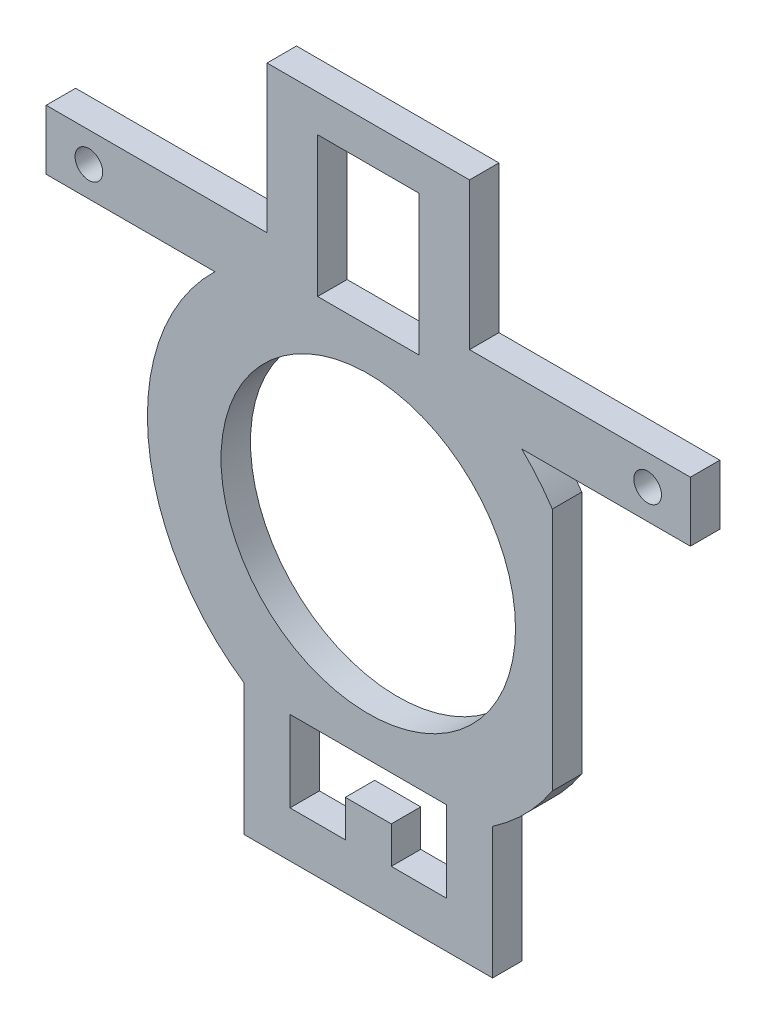
ISO-10303-21;
HEADER;
FILE_DESCRIPTION(('STEP AP214'),'2;1');
FILE_NAME('part.step','',(''),(''),'','','');
FILE_SCHEMA(('AUTOMOTIVE_DESIGN { 1 0 10303 214 1 1 1 1 }'));
ENDSEC;
DATA;
#1=APPLICATION_CONTEXT('core data for automotive mechanical design processes');
#2=APPLICATION_PROTOCOL_DEFINITION('international standard','automotive_design',2000,#1);
#3=PRODUCT_CONTEXT('',#1,'mechanical');
#4=PRODUCT('Part','Part','',(#3));
#5=PRODUCT_RELATED_PRODUCT_CATEGORY('part','',(#4));
#6=PRODUCT_DEFINITION_FORMATION('','',#4);
#7=PRODUCT_DEFINITION_CONTEXT('part definition',#1,'design');
#8=PRODUCT_DEFINITION('design','',#6,#7);
#9=PRODUCT_DEFINITION_SHAPE('','',#8);
#10=(LENGTH_UNIT() NAMED_UNIT(*) SI_UNIT(.MILLI.,.METRE.));
#11=(NAMED_UNIT(*) PLANE_ANGLE_UNIT() SI_UNIT($,.RADIAN.));
#12=(NAMED_UNIT(*) SI_UNIT($,.STERADIAN.) SOLID_ANGLE_UNIT());
#13=UNCERTAINTY_MEASURE_WITH_UNIT(LENGTH_MEASURE(1.E-05),#10,'distance_accuracy_value','');
#14=(GEOMETRIC_REPRESENTATION_CONTEXT(3) GLOBAL_UNCERTAINTY_ASSIGNED_CONTEXT((#13)) GLOBAL_UNIT_ASSIGNED_CONTEXT((#10,
#11,#12)) REPRESENTATION_CONTEXT('',''));
#15=CARTESIAN_POINT('',(0.,0.,0.));
#16=DIRECTION('',(0.,0.,1.));
#17=DIRECTION('',(1.,0.,0.));
#18=AXIS2_PLACEMENT_3D('',#15,#16,#17);
#19=CARTESIAN_POINT('',(-4.2545,-39.0072043434314,1.6));
#20=DIRECTION('',(-1.,0.,0.));
#21=DIRECTION('',(0.,-1.,0.));
#22=AXIS2_PLACEMENT_3D('',#19,#20,#21);
#23=PLANE('',#22);
#24=DIRECTION('',(0.,1.,0.));
#25=VECTOR('',#24,1.);
#26=CARTESIAN_POINT('',(-4.2545,-39.0072043434314,0.));
#27=LINE('',#26,#25);
#28=CARTESIAN_POINT('',(-4.2545,-14.554889955105,0.));
#29=VERTEX_POINT('',#28);
#30=CARTESIAN_POINT('',(-4.2545,-10.154889955105,0.));
#31=VERTEX_POINT('',#30);
#32=EDGE_CURVE('E313',#29,#31,#27,.T.);
#33=ORIENTED_EDGE('',*,*,#32,.T.);
#34=DIRECTION('',(0.,0.,-1.));
#35=VECTOR('',#34,1.);
#36=CARTESIAN_POINT('',(-4.2545,-10.154889955105,1.6));
#37=LINE('',#36,#35);
#38=CARTESIAN_POINT('',(-4.2545,-10.154889955105,1.6));
#39=VERTEX_POINT('',#38);
#40=EDGE_CURVE('E11',#39,#31,#37,.T.);
#41=ORIENTED_EDGE('',*,*,#40,.F.);
#42=DIRECTION('',(0.,1.,0.));
#43=VECTOR('',#42,1.);
#44=CARTESIAN_POINT('',(-4.2545,-39.0072043434314,1.6));
#45=LINE('',#44,#43);
#46=CARTESIAN_POINT('',(-4.2545,-14.554889955105,1.6));
#47=VERTEX_POINT('',#46);
#48=EDGE_CURVE('E460',#47,#39,#45,.T.);
#49=ORIENTED_EDGE('',*,*,#48,.F.);
#50=DIRECTION('',(0.,0.,-1.));
#51=VECTOR('',#50,1.);
#52=CARTESIAN_POINT('',(-4.2545,-14.554889955105,1.6));
#53=LINE('',#52,#51);
#54=EDGE_CURVE('E340',#47,#29,#53,.T.);
#55=ORIENTED_EDGE('',*,*,#54,.T.);
#56=EDGE_LOOP('',(#33,#41,#49,#55));
#57=FACE_BOUND('',#56,.T.);
#58=ADVANCED_FACE('F33',(#57),#23,.F.);
#59=CARTESIAN_POINT('',(1.32742075370535,-10.154889955105,1.6));
#60=DIRECTION('',(0.,-1.,0.));
#61=DIRECTION('',(1.,0.,0.));
#62=AXIS2_PLACEMENT_3D('',#59,#60,#61);
#63=PLANE('',#62);
#64=DIRECTION('',(-1.,0.,0.));
#65=VECTOR('',#64,1.);
#66=CARTESIAN_POINT('',(1.32742075370535,-10.154889955105,0.));
#67=LINE('',#66,#65);
#68=CARTESIAN_POINT('',(4.2545,-10.154889955105,0.));
#69=VERTEX_POINT('',#68);
#70=EDGE_CURVE('E316',#69,#31,#67,.T.);
#71=ORIENTED_EDGE('',*,*,#70,.F.);
#72=DIRECTION('',(0.,0.,-1.));
#73=VECTOR('',#72,1.);
#74=CARTESIAN_POINT('',(4.2545,-10.154889955105,1.6));
#75=LINE('',#74,#73);
#76=CARTESIAN_POINT('',(4.2545,-10.154889955105,1.6));
#77=VERTEX_POINT('',#76);
#78=EDGE_CURVE('E43',#77,#69,#75,.T.);
#79=ORIENTED_EDGE('',*,*,#78,.F.);
#80=DIRECTION('',(-1.,0.,0.));
#81=VECTOR('',#80,1.);
#82=CARTESIAN_POINT('',(1.32742075370535,-10.154889955105,1.6));
#83=LINE('',#82,#81);
#84=EDGE_CURVE('E462',#77,#39,#83,.T.);
#85=ORIENTED_EDGE('',*,*,#84,.T.);
#86=ORIENTED_EDGE('',*,*,#40,.T.);
#87=EDGE_LOOP('',(#71,#79,#85,#86));
#88=FACE_BOUND('',#87,.T.);
#89=ADVANCED_FACE('F503',(#88),#63,.T.);
#90=CARTESIAN_POINT('',(4.25450000000001,-39.0072043434314,1.6));
#91=DIRECTION('',(-1.,0.,0.));
#92=DIRECTION('',(0.,-1.,0.));
#93=AXIS2_PLACEMENT_3D('',#90,#91,#92);
#94=PLANE('',#93);
#95=DIRECTION('',(0.,1.,0.));
#96=VECTOR('',#95,1.);
#97=CARTESIAN_POINT('',(4.25450000000001,-39.0072043434314,0.));
#98=LINE('',#97,#96);
#99=CARTESIAN_POINT('',(4.2545,-14.554889955105,0.));
#100=VERTEX_POINT('',#99);
#101=EDGE_CURVE('E319',#100,#69,#98,.T.);
#102=ORIENTED_EDGE('',*,*,#101,.F.);
#103=DIRECTION('',(0.,0.,-1.));
#104=VECTOR('',#103,1.);
#105=CARTESIAN_POINT('',(4.2545,-14.554889955105,1.6));
#106=LINE('',#105,#104);
#107=CARTESIAN_POINT('',(4.2545,-14.554889955105,1.6));
#108=VERTEX_POINT('',#107);
#109=EDGE_CURVE('E348',#108,#100,#106,.T.);
#110=ORIENTED_EDGE('',*,*,#109,.F.);
#111=DIRECTION('',(0.,1.,0.));
#112=VECTOR('',#111,1.);
#113=CARTESIAN_POINT('',(4.25450000000001,-39.0072043434314,1.6));
#114=LINE('',#113,#112);
#115=EDGE_CURVE('E465',#108,#77,#114,.T.);
#116=ORIENTED_EDGE('',*,*,#115,.T.);
#117=ORIENTED_EDGE('',*,*,#78,.T.);
#118=EDGE_LOOP('',(#102,#110,#116,#117));
#119=FACE_BOUND('',#118,.T.);
#120=ADVANCED_FACE('F501',(#119),#94,.T.);
#121=CARTESIAN_POINT('',(1.32742075370534,-14.554889955105,1.6));
#122=DIRECTION('',(0.,-1.,0.));
#123=DIRECTION('',(1.,0.,0.));
#124=AXIS2_PLACEMENT_3D('',#121,#122,#123);
#125=PLANE('',#124);
#126=DIRECTION('',(-1.,0.,0.));
#127=VECTOR('',#126,1.);
#128=CARTESIAN_POINT('',(1.32742075370534,-14.554889955105,0.));
#129=LINE('',#128,#127);
#130=CARTESIAN_POINT('',(1.25,-14.554889955105,0.));
#131=VERTEX_POINT('',#130);
#132=EDGE_CURVE('E322',#100,#131,#129,.T.);
#133=ORIENTED_EDGE('',*,*,#132,.T.);
#134=DIRECTION('',(0.,0.,-1.));
#135=VECTOR('',#134,1.);
#136=CARTESIAN_POINT('',(1.25,-14.554889955105,1.6));
#137=LINE('',#136,#135);
#138=CARTESIAN_POINT('',(1.25,-14.554889955105,1.6));
#139=VERTEX_POINT('',#138);
#140=EDGE_CURVE('E345',#139,#131,#137,.T.);
#141=ORIENTED_EDGE('',*,*,#140,.F.);
#142=DIRECTION('',(-1.,0.,0.));
#143=VECTOR('',#142,1.);
#144=CARTESIAN_POINT('',(1.32742075370534,-14.554889955105,1.6));
#145=LINE('',#144,#143);
#146=EDGE_CURVE('E248',#108,#139,#145,.T.);
#147=ORIENTED_EDGE('',*,*,#146,.F.);
#148=ORIENTED_EDGE('',*,*,#109,.T.);
#149=EDGE_LOOP('',(#133,#141,#147,#148));
#150=FACE_BOUND('',#149,.T.);
#151=ADVANCED_FACE('F472',(#150),#125,.F.);
#152=CARTESIAN_POINT('',(1.24999999999996,-39.0072043434314,1.6));
#153=DIRECTION('',(-1.,0.,0.));
#154=DIRECTION('',(0.,-1.,0.));
#155=AXIS2_PLACEMENT_3D('',#152,#153,#154);
#156=PLANE('',#155);
#157=DIRECTION('',(0.,1.,0.));
#158=VECTOR('',#157,1.);
#159=CARTESIAN_POINT('',(1.24999999999996,-39.0072043434314,0.));
#160=LINE('',#159,#158);
#161=CARTESIAN_POINT('',(1.25,-12.554889955105,0.));
#162=VERTEX_POINT('',#161);
#163=EDGE_CURVE('E324',#131,#162,#160,.T.);
#164=ORIENTED_EDGE('',*,*,#163,.T.);
#165=DIRECTION('',(0.,0.,-1.));
#166=VECTOR('',#165,1.);
#167=CARTESIAN_POINT('',(1.25,-12.554889955105,1.6));
#168=LINE('',#167,#166);
#169=CARTESIAN_POINT('',(1.25,-12.554889955105,1.6));
#170=VERTEX_POINT('',#169);
#171=EDGE_CURVE('E235',#170,#162,#168,.T.);
#172=ORIENTED_EDGE('',*,*,#171,.F.);
#173=DIRECTION('',(0.,1.,0.));
#174=VECTOR('',#173,1.);
#175=CARTESIAN_POINT('',(1.24999999999996,-39.0072043434314,1.6));
#176=LINE('',#175,#174);
#177=EDGE_CURVE('E241',#139,#170,#176,.T.);
#178=ORIENTED_EDGE('',*,*,#177,.F.);
#179=ORIENTED_EDGE('',*,*,#140,.T.);
#180=EDGE_LOOP('',(#164,#172,#178,#179));
#181=FACE_BOUND('',#180,.T.);
#182=ADVANCED_FACE('F476',(#181),#156,.F.);
#183=CARTESIAN_POINT('',(1.32742075370533,-12.554889955105,1.6));
#184=DIRECTION('',(0.,1.,0.));
#185=DIRECTION('',(-1.,0.,0.));
#186=AXIS2_PLACEMENT_3D('',#183,#184,#185);
#187=PLANE('',#186);
#188=DIRECTION('',(1.,0.,0.));
#189=VECTOR('',#188,1.);
#190=CARTESIAN_POINT('',(1.32742075370533,-12.554889955105,0.));
#191=LINE('',#190,#189);
#192=CARTESIAN_POINT('',(-1.25,-12.554889955105,0.));
#193=VERTEX_POINT('',#192);
#194=EDGE_CURVE('E230',#193,#162,#191,.T.);
#195=ORIENTED_EDGE('',*,*,#194,.F.);
#196=DIRECTION('',(0.,0.,-1.));
#197=VECTOR('',#196,1.);
#198=CARTESIAN_POINT('',(-1.25,-12.554889955105,1.6));
#199=LINE('',#198,#197);
#200=CARTESIAN_POINT('',(-1.25,-12.554889955105,1.6));
#201=VERTEX_POINT('',#200);
#202=EDGE_CURVE('E225',#201,#193,#199,.T.);
#203=ORIENTED_EDGE('',*,*,#202,.F.);
#204=DIRECTION('',(1.,0.,0.));
#205=VECTOR('',#204,1.);
#206=CARTESIAN_POINT('',(1.32742075370533,-12.554889955105,1.6));
#207=LINE('',#206,#205);
#208=EDGE_CURVE('E228',#201,#170,#207,.T.);
#209=ORIENTED_EDGE('',*,*,#208,.T.);
#210=ORIENTED_EDGE('',*,*,#171,.T.);
#211=EDGE_LOOP('',(#195,#203,#209,#210));
#212=FACE_BOUND('',#211,.T.);
#213=ADVANCED_FACE('F227',(#212),#187,.T.);
#214=CARTESIAN_POINT('',(-1.24999999999991,-39.0072043434314,1.6));
#215=DIRECTION('',(-1.,0.,0.));
#216=DIRECTION('',(0.,-1.,0.));
#217=AXIS2_PLACEMENT_3D('',#214,#215,#216);
#218=PLANE('',#217);
#219=DIRECTION('',(0.,1.,0.));
#220=VECTOR('',#219,1.);
#221=CARTESIAN_POINT('',(-1.24999999999991,-39.0072043434314,0.));
#222=LINE('',#221,#220);
#223=CARTESIAN_POINT('',(-1.24999999999999,-14.554889955105,0.));
#224=VERTEX_POINT('',#223);
#225=EDGE_CURVE('E328',#224,#193,#222,.T.);
#226=ORIENTED_EDGE('',*,*,#225,.F.);
#227=DIRECTION('',(0.,0.,-1.));
#228=VECTOR('',#227,1.);
#229=CARTESIAN_POINT('',(-1.24999999999999,-14.554889955105,1.6));
#230=LINE('',#229,#228);
#231=CARTESIAN_POINT('',(-1.24999999999999,-14.554889955105,1.6));
#232=VERTEX_POINT('',#231);
#233=EDGE_CURVE('E139',#232,#224,#230,.T.);
#234=ORIENTED_EDGE('',*,*,#233,.F.);
#235=DIRECTION('',(0.,1.,0.));
#236=VECTOR('',#235,1.);
#237=CARTESIAN_POINT('',(-1.24999999999991,-39.0072043434314,1.6));
#238=LINE('',#237,#236);
#239=EDGE_CURVE('E239',#232,#201,#238,.T.);
#240=ORIENTED_EDGE('',*,*,#239,.T.);
#241=ORIENTED_EDGE('',*,*,#202,.T.);
#242=EDGE_LOOP('',(#226,#234,#240,#241));
#243=FACE_BOUND('',#242,.T.);
#244=ADVANCED_FACE('F244',(#243),#218,.T.);
#245=CARTESIAN_POINT('',(-2.74999999999946,-39.0072043434314,1.6));
#246=DIRECTION('',(1.,0.,0.));
#247=DIRECTION('',(0.,1.,0.));
#248=AXIS2_PLACEMENT_3D('',#245,#246,#247);
#249=PLANE('',#248);
#250=DIRECTION('',(0.,-1.,0.));
#251=VECTOR('',#250,1.);
#252=CARTESIAN_POINT('',(-2.74999999999946,-39.0072043434314,0.));
#253=LINE('',#252,#251);
#254=CARTESIAN_POINT('',(-2.75000000000002,17.87,0.));
#255=VERTEX_POINT('',#254);
#256=CARTESIAN_POINT('',(-2.74999999999998,10.2576946666319,0.));
#257=VERTEX_POINT('',#256);
#258=EDGE_CURVE('E301',#255,#257,#253,.T.);
#259=ORIENTED_EDGE('',*,*,#258,.F.);
#260=DIRECTION('',(0.,0.,-1.));
#261=VECTOR('',#260,1.);
#262=CARTESIAN_POINT('',(-2.75000000000002,17.87,1.6));
#263=LINE('',#262,#261);
#264=CARTESIAN_POINT('',(-2.75000000000002,17.87,1.6));
#265=VERTEX_POINT('',#264);
#266=EDGE_CURVE('E342',#265,#255,#263,.T.);
#267=ORIENTED_EDGE('',*,*,#266,.F.);
#268=DIRECTION('',(0.,-1.,0.));
#269=VECTOR('',#268,1.);
#270=CARTESIAN_POINT('',(-2.74999999999946,-39.0072043434314,1.6));
#271=LINE('',#270,#269);
#272=CARTESIAN_POINT('',(-2.74999999999998,10.2576946666319,1.6));
#273=VERTEX_POINT('',#272);
#274=EDGE_CURVE('E449',#265,#273,#271,.T.);
#275=ORIENTED_EDGE('',*,*,#274,.T.);
#276=DIRECTION('',(0.,0.,-1.));
#277=VECTOR('',#276,1.);
#278=CARTESIAN_POINT('',(-2.74999999999998,10.2576946666319,1.6));
#279=LINE('',#278,#277);
#280=EDGE_CURVE('E351',#273,#257,#279,.T.);
#281=ORIENTED_EDGE('',*,*,#280,.T.);
#282=EDGE_LOOP('',(#259,#267,#275,#281));
#283=FACE_BOUND('',#282,.T.);
#284=ADVANCED_FACE('F519',(#283),#249,.T.);
#285=CARTESIAN_POINT('',(1.32742075370535,17.87,1.6));
#286=DIRECTION('',(0.,1.,0.));
#287=DIRECTION('',(0.,0.,1.));
#288=AXIS2_PLACEMENT_3D('',#285,#286,#287);
#289=PLANE('',#288);
#290=DIRECTION('',(1.,0.,0.));
#291=VECTOR('',#290,1.);
#292=CARTESIAN_POINT('',(1.32742075370535,17.87,0.));
#293=LINE('',#292,#291);
#294=CARTESIAN_POINT('',(2.75000000000006,17.87,0.));
#295=VERTEX_POINT('',#294);
#296=EDGE_CURVE('E304',#255,#295,#293,.T.);
#297=ORIENTED_EDGE('',*,*,#296,.T.);
#298=DIRECTION('',(0.,0.,-1.));
#299=VECTOR('',#298,1.);
#300=CARTESIAN_POINT('',(2.75000000000006,17.87,1.6));
#301=LINE('',#300,#299);
#302=CARTESIAN_POINT('',(2.75000000000006,17.87,1.6));
#303=VERTEX_POINT('',#302);
#304=EDGE_CURVE('E356',#303,#295,#301,.T.);
#305=ORIENTED_EDGE('',*,*,#304,.F.);
#306=DIRECTION('',(1.,0.,0.));
#307=VECTOR('',#306,1.);
#308=CARTESIAN_POINT('',(1.32742075370535,17.87,1.6));
#309=LINE('',#308,#307);
#310=EDGE_CURVE('E452',#265,#303,#309,.T.);
#311=ORIENTED_EDGE('',*,*,#310,.F.);
#312=ORIENTED_EDGE('',*,*,#266,.T.);
#313=EDGE_LOOP('',(#297,#305,#311,#312));
#314=FACE_BOUND('',#313,.T.);
#315=ADVANCED_FACE('F515',(#314),#289,.F.);
#316=CARTESIAN_POINT('',(2.75000000000007,-39.0072043434314,1.6));
#317=DIRECTION('',(1.,0.,0.));
#318=DIRECTION('',(0.,1.,0.));
#319=AXIS2_PLACEMENT_3D('',#316,#317,#318);
#320=PLANE('',#319);
#321=DIRECTION('',(0.,-1.,0.));
#322=VECTOR('',#321,1.);
#323=CARTESIAN_POINT('',(2.75000000000007,-39.0072043434314,0.));
#324=LINE('',#323,#322);
#325=CARTESIAN_POINT('',(2.75000000000006,10.2576946666318,0.));
#326=VERTEX_POINT('',#325);
#327=EDGE_CURVE('E307',#295,#326,#324,.T.);
#328=ORIENTED_EDGE('',*,*,#327,.T.);
#329=DIRECTION('',(0.,0.,-1.));
#330=VECTOR('',#329,1.);
#331=CARTESIAN_POINT('',(2.75000000000006,10.2576946666318,1.6));
#332=LINE('',#331,#330);
#333=CARTESIAN_POINT('',(2.75000000000006,10.2576946666318,1.6));
#334=VERTEX_POINT('',#333);
#335=EDGE_CURVE('E353',#334,#326,#332,.T.);
#336=ORIENTED_EDGE('',*,*,#335,.F.);
#337=DIRECTION('',(0.,-1.,0.));
#338=VECTOR('',#337,1.);
#339=CARTESIAN_POINT('',(2.75000000000007,-39.0072043434314,1.6));
#340=LINE('',#339,#338);
#341=EDGE_CURVE('E455',#303,#334,#340,.T.);
#342=ORIENTED_EDGE('',*,*,#341,.F.);
#343=ORIENTED_EDGE('',*,*,#304,.T.);
#344=EDGE_LOOP('',(#328,#336,#342,#343));
#345=FACE_BOUND('',#344,.T.);
#346=ADVANCED_FACE('F512',(#345),#320,.F.);
#347=CARTESIAN_POINT('',(5.49999999999998,-39.0072043434314,1.6));
#348=DIRECTION('',(1.,0.,0.));
#349=DIRECTION('',(0.,1.,0.));
#350=AXIS2_PLACEMENT_3D('',#347,#348,#349);
#351=PLANE('',#350);
#352=DIRECTION('',(0.,-1.,0.));
#353=VECTOR('',#352,1.);
#354=CARTESIAN_POINT('',(5.49999999999998,-39.0072043434314,0.));
#355=LINE('',#354,#353);
#356=CARTESIAN_POINT('',(5.5,19.87,0.));
#357=VERTEX_POINT('',#356);
#358=CARTESIAN_POINT('',(5.5,11.8826946666319,0.));
#359=VERTEX_POINT('',#358);
#360=EDGE_CURVE('E260',#357,#359,#355,.T.);
#361=ORIENTED_EDGE('',*,*,#360,.F.);
#362=DIRECTION('',(0.,0.,-1.));
#363=VECTOR('',#362,1.);
#364=CARTESIAN_POINT('',(5.5,19.87,1.6));
#365=LINE('',#364,#363);
#366=CARTESIAN_POINT('',(5.5,19.87,1.6));
#367=VERTEX_POINT('',#366);
#368=EDGE_CURVE('E37',#367,#357,#365,.T.);
#369=ORIENTED_EDGE('',*,*,#368,.F.);
#370=DIRECTION('',(0.,-1.,0.));
#371=VECTOR('',#370,1.);
#372=CARTESIAN_POINT('',(5.49999999999998,-39.0072043434314,1.6));
#373=LINE('',#372,#371);
#374=CARTESIAN_POINT('',(5.5,11.8826946666319,1.6));
#375=VERTEX_POINT('',#374);
#376=EDGE_CURVE('E339',#367,#375,#373,.T.);
#377=ORIENTED_EDGE('',*,*,#376,.T.);
#378=DIRECTION('',(0.,0.,-1.));
#379=VECTOR('',#378,1.);
#380=CARTESIAN_POINT('',(5.5,11.8826946666319,1.6));
#381=LINE('',#380,#379);
#382=EDGE_CURVE('E259',#375,#359,#381,.T.);
#383=ORIENTED_EDGE('',*,*,#382,.T.);
#384=EDGE_LOOP('',(#361,#369,#377,#383));
#385=FACE_BOUND('',#384,.T.);
#386=ADVANCED_FACE('F35',(#385),#351,.T.);
#387=CARTESIAN_POINT('',(1.32742075370535,19.87,1.6));
#388=DIRECTION('',(0.,1.,0.));
#389=DIRECTION('',(0.,0.,1.));
#390=AXIS2_PLACEMENT_3D('',#387,#388,#389);
#391=PLANE('',#390);
#392=DIRECTION('',(1.,0.,0.));
#393=VECTOR('',#392,1.);
#394=CARTESIAN_POINT('',(1.32742075370535,19.87,0.));
#395=LINE('',#394,#393);
#396=CARTESIAN_POINT('',(-5.5,19.87,0.));
#397=VERTEX_POINT('',#396);
#398=EDGE_CURVE('E263',#397,#357,#395,.T.);
#399=ORIENTED_EDGE('',*,*,#398,.F.);
#400=DIRECTION('',(0.,0.,-1.));
#401=VECTOR('',#400,1.);
#402=CARTESIAN_POINT('',(-5.5,19.87,1.6));
#403=LINE('',#402,#401);
#404=CARTESIAN_POINT('',(-5.5,19.87,1.6));
#405=VERTEX_POINT('',#404);
#406=EDGE_CURVE('E390',#405,#397,#403,.T.);
#407=ORIENTED_EDGE('',*,*,#406,.F.);
#408=DIRECTION('',(1.,0.,0.));
#409=VECTOR('',#408,1.);
#410=CARTESIAN_POINT('',(1.32742075370535,19.87,1.6));
#411=LINE('',#410,#409);
#412=EDGE_CURVE('E399',#405,#367,#411,.T.);
#413=ORIENTED_EDGE('',*,*,#412,.T.);
#414=ORIENTED_EDGE('',*,*,#368,.T.);
#415=EDGE_LOOP('',(#399,#407,#413,#414));
#416=FACE_BOUND('',#415,.T.);
#417=ADVANCED_FACE('F397',(#416),#391,.T.);
#418=CARTESIAN_POINT('',(-5.49999999999997,-39.0072043434314,1.6));
#419=DIRECTION('',(-1.,0.,0.));
#420=DIRECTION('',(0.,-1.,0.));
#421=AXIS2_PLACEMENT_3D('',#418,#419,#420);
#422=PLANE('',#421);
#423=DIRECTION('',(0.,1.,0.));
#424=VECTOR('',#423,1.);
#425=CARTESIAN_POINT('',(-5.49999999999997,-39.0072043434314,0.));
#426=LINE('',#425,#424);
#427=CARTESIAN_POINT('',(-5.5,11.8826946666319,0.));
#428=VERTEX_POINT('',#427);
#429=EDGE_CURVE('E266',#428,#397,#426,.T.);
#430=ORIENTED_EDGE('',*,*,#429,.F.);
#431=DIRECTION('',(0.,0.,-1.));
#432=VECTOR('',#431,1.);
#433=CARTESIAN_POINT('',(-5.5,11.8826946666319,1.6));
#434=LINE('',#433,#432);
#435=CARTESIAN_POINT('',(-5.5,11.8826946666319,1.6));
#436=VERTEX_POINT('',#435);
#437=EDGE_CURVE('E389',#436,#428,#434,.T.);
#438=ORIENTED_EDGE('',*,*,#437,.F.);
#439=DIRECTION('',(0.,1.,0.));
#440=VECTOR('',#439,1.);
#441=CARTESIAN_POINT('',(-5.49999999999997,-39.0072043434314,1.6));
#442=LINE('',#441,#440);
#443=EDGE_CURVE('E409',#436,#405,#442,.T.);
#444=ORIENTED_EDGE('',*,*,#443,.T.);
#445=ORIENTED_EDGE('',*,*,#406,.T.);
#446=EDGE_LOOP('',(#430,#438,#444,#445));
#447=FACE_BOUND('',#446,.T.);
#448=ADVANCED_FACE('F406',(#447),#422,.T.);
#449=CARTESIAN_POINT('',(1.32742075370534,11.8826946666319,1.6));
#450=DIRECTION('',(0.,-1.,0.));
#451=DIRECTION('',(1.,0.,0.));
#452=AXIS2_PLACEMENT_3D('',#449,#450,#451);
#453=PLANE('',#452);
#454=DIRECTION('',(-1.,0.,0.));
#455=VECTOR('',#454,1.);
#456=CARTESIAN_POINT('',(1.32742075370534,11.8826946666319,0.));
#457=LINE('',#456,#455);
#458=CARTESIAN_POINT('',(-17.5,11.8826946666318,0.));
#459=VERTEX_POINT('',#458);
#460=EDGE_CURVE('E269',#428,#459,#457,.T.);
#461=ORIENTED_EDGE('',*,*,#460,.T.);
#462=DIRECTION('',(0.,0.,-1.));
#463=VECTOR('',#462,1.);
#464=CARTESIAN_POINT('',(-17.5,11.8826946666318,1.6));
#465=LINE('',#464,#463);
#466=CARTESIAN_POINT('',(-17.5,11.8826946666318,1.6));
#467=VERTEX_POINT('',#466);
#468=EDGE_CURVE('E387',#467,#459,#465,.T.);
#469=ORIENTED_EDGE('',*,*,#468,.F.);
#470=DIRECTION('',(-1.,0.,0.));
#471=VECTOR('',#470,1.);
#472=CARTESIAN_POINT('',(1.32742075370534,11.8826946666319,1.6));
#473=LINE('',#472,#471);
#474=EDGE_CURVE('E412',#436,#467,#473,.T.);
#475=ORIENTED_EDGE('',*,*,#474,.F.);
#476=ORIENTED_EDGE('',*,*,#437,.T.);
#477=EDGE_LOOP('',(#461,#469,#475,#476));
#478=FACE_BOUND('',#477,.T.);
#479=ADVANCED_FACE('F413',(#478),#453,.F.);
#480=CARTESIAN_POINT('',(-17.5,-39.0072043434314,1.6));
#481=DIRECTION('',(-1.,0.,0.));
#482=DIRECTION('',(0.,0.,1.));
#483=AXIS2_PLACEMENT_3D('',#480,#481,#482);
#484=PLANE('',#483);
#485=DIRECTION('',(0.,1.,0.));
#486=VECTOR('',#485,1.);
#487=CARTESIAN_POINT('',(-17.5,-39.0072043434314,0.));
#488=LINE('',#487,#486);
#489=CARTESIAN_POINT('',(-17.5,8.63269466663185,0.));
#490=VERTEX_POINT('',#489);
#491=EDGE_CURVE('E272',#490,#459,#488,.T.);
#492=ORIENTED_EDGE('',*,*,#491,.F.);
#493=DIRECTION('',(0.,0.,-1.));
#494=VECTOR('',#493,1.);
#495=CARTESIAN_POINT('',(-17.5,8.63269466663185,1.6));
#496=LINE('',#495,#494);
#497=CARTESIAN_POINT('',(-17.5,8.63269466663185,1.6));
#498=VERTEX_POINT('',#497);
#499=EDGE_CURVE('E385',#498,#490,#496,.T.);
#500=ORIENTED_EDGE('',*,*,#499,.F.);
#501=DIRECTION('',(0.,1.,0.));
#502=VECTOR('',#501,1.);
#503=CARTESIAN_POINT('',(-17.5,-39.0072043434314,1.6));
#504=LINE('',#503,#502);
#505=EDGE_CURVE('E417',#498,#467,#504,.T.);
#506=ORIENTED_EDGE('',*,*,#505,.T.);
#507=ORIENTED_EDGE('',*,*,#468,.T.);
#508=EDGE_LOOP('',(#492,#500,#506,#507));
#509=FACE_BOUND('',#508,.T.);
#510=ADVANCED_FACE('F561',(#509),#484,.T.);
#511=CARTESIAN_POINT('',(1.32742075370534,8.63269466663186,1.6));
#512=DIRECTION('',(0.,-1.,0.));
#513=DIRECTION('',(1.,0.,0.));
#514=AXIS2_PLACEMENT_3D('',#511,#512,#513);
#515=PLANE('',#514);
#516=DIRECTION('',(-1.,0.,0.));
#517=VECTOR('',#516,1.);
#518=CARTESIAN_POINT('',(1.32742075370534,8.63269466663186,0.));
#519=LINE('',#518,#517);
#520=CARTESIAN_POINT('',(-8.33526141117997,8.63269466663186,0.));
#521=VERTEX_POINT('',#520);
#522=EDGE_CURVE('E275',#521,#490,#519,.T.);
#523=ORIENTED_EDGE('',*,*,#522,.F.);
#524=DIRECTION('',(0.,0.,-1.));
#525=VECTOR('',#524,1.);
#526=CARTESIAN_POINT('',(-8.33526141117997,8.63269466663186,1.6));
#527=LINE('',#526,#525);
#528=CARTESIAN_POINT('',(-8.33526141117997,8.63269466663186,1.6));
#529=VERTEX_POINT('',#528);
#530=EDGE_CURVE('E383',#529,#521,#527,.T.);
#531=ORIENTED_EDGE('',*,*,#530,.F.);
#532=DIRECTION('',(-1.,0.,0.));
#533=VECTOR('',#532,1.);
#534=CARTESIAN_POINT('',(1.32742075370534,8.63269466663186,1.6));
#535=LINE('',#534,#533);
#536=EDGE_CURVE('E425',#529,#498,#535,.T.);
#537=ORIENTED_EDGE('',*,*,#536,.T.);
#538=ORIENTED_EDGE('',*,*,#499,.T.);
#539=EDGE_LOOP('',(#523,#531,#537,#538));
#540=FACE_BOUND('',#539,.T.);
#541=ADVANCED_FACE('F558',(#540),#515,.T.);
#542=CARTESIAN_POINT('',(0.,0.,1.6));
#543=DIRECTION('',(0.,0.,-1.));
#544=DIRECTION('',(-1.,0.,0.));
#545=AXIS2_PLACEMENT_3D('',#542,#543,#544);
#546=CYLINDRICAL_SURFACE('',#545,12.);
#547=CARTESIAN_POINT('',(0.,0.,0.));
#548=DIRECTION('',(0.,0.,1.));
#549=DIRECTION('',(1.,0.,0.));
#550=AXIS2_PLACEMENT_3D('',#547,#548,#549);
#551=CIRCLE('',#550,12.);
#552=CARTESIAN_POINT('',(-6.7545,-9.91850441094826,0.));
#553=VERTEX_POINT('',#552);
#554=EDGE_CURVE('E278',#521,#553,#551,.T.);
#555=ORIENTED_EDGE('',*,*,#554,.T.);
#556=DIRECTION('',(0.,0.,-1.));
#557=VECTOR('',#556,1.);
#558=CARTESIAN_POINT('',(-6.7545,-9.91850441094826,1.6));
#559=LINE('',#558,#557);
#560=CARTESIAN_POINT('',(-6.7545,-9.91850441094826,1.6));
#561=VERTEX_POINT('',#560);
#562=EDGE_CURVE('E381',#561,#553,#559,.T.);
#563=ORIENTED_EDGE('',*,*,#562,.F.);
#564=CARTESIAN_POINT('',(0.,0.,1.6));
#565=DIRECTION('',(0.,0.,1.));
#566=DIRECTION('',(1.,0.,0.));
#567=AXIS2_PLACEMENT_3D('',#564,#565,#566);
#568=CIRCLE('',#567,12.);
#569=EDGE_CURVE('E428',#529,#561,#568,.T.);
#570=ORIENTED_EDGE('',*,*,#569,.F.);
#571=ORIENTED_EDGE('',*,*,#530,.T.);
#572=EDGE_LOOP('',(#555,#563,#570,#571));
#573=FACE_BOUND('',#572,.T.);
#574=ADVANCED_FACE('F541',(#573),#546,.T.);
#575=CARTESIAN_POINT('',(-6.7545,-39.0072043434314,1.6));
#576=DIRECTION('',(-1.,0.,0.));
#577=DIRECTION('',(0.,0.,1.));
#578=AXIS2_PLACEMENT_3D('',#575,#576,#577);
#579=PLANE('',#578);
#580=DIRECTION('',(0.,1.,0.));
#581=VECTOR('',#580,1.);
#582=CARTESIAN_POINT('',(-6.7545,-39.0072043434314,0.));
#583=LINE('',#582,#581);
#584=CARTESIAN_POINT('',(-6.7545,-17.054889955105,0.));
#585=VERTEX_POINT('',#584);
#586=EDGE_CURVE('E281',#585,#553,#583,.T.);
#587=ORIENTED_EDGE('',*,*,#586,.F.);
#588=DIRECTION('',(0.,0.,-1.));
#589=VECTOR('',#588,1.);
#590=CARTESIAN_POINT('',(-6.7545,-17.054889955105,1.6));
#591=LINE('',#590,#589);
#592=CARTESIAN_POINT('',(-6.7545,-17.054889955105,1.6));
#593=VERTEX_POINT('',#592);
#594=EDGE_CURVE('E379',#593,#585,#591,.T.);
#595=ORIENTED_EDGE('',*,*,#594,.F.);
#596=DIRECTION('',(0.,1.,0.));
#597=VECTOR('',#596,1.);
#598=CARTESIAN_POINT('',(-6.7545,-39.0072043434314,1.6));
#599=LINE('',#598,#597);
#600=EDGE_CURVE('E430',#593,#561,#599,.T.);
#601=ORIENTED_EDGE('',*,*,#600,.T.);
#602=ORIENTED_EDGE('',*,*,#562,.T.);
#603=EDGE_LOOP('',(#587,#595,#601,#602));
#604=FACE_BOUND('',#603,.T.);
#605=ADVANCED_FACE('F553',(#604),#579,.T.);
#606=CARTESIAN_POINT('',(1.32742075370535,-17.054889955105,1.6));
#607=DIRECTION('',(0.,-1.,0.));
#608=DIRECTION('',(0.,0.,-1.));
#609=AXIS2_PLACEMENT_3D('',#606,#607,#608);
#610=PLANE('',#609);
#611=DIRECTION('',(-1.,0.,0.));
#612=VECTOR('',#611,1.);
#613=CARTESIAN_POINT('',(1.32742075370535,-17.054889955105,0.));
#614=LINE('',#613,#612);
#615=CARTESIAN_POINT('',(6.75450000000001,-17.054889955105,0.));
#616=VERTEX_POINT('',#615);
#617=EDGE_CURVE('E286',#616,#585,#614,.T.);
#618=ORIENTED_EDGE('',*,*,#617,.F.);
#619=DIRECTION('',(0.,0.,-1.));
#620=VECTOR('',#619,1.);
#621=CARTESIAN_POINT('',(6.75450000000001,-17.054889955105,1.6));
#622=LINE('',#621,#620);
#623=CARTESIAN_POINT('',(6.75450000000001,-17.054889955105,1.6));
#624=VERTEX_POINT('',#623);
#625=EDGE_CURVE('E377',#624,#616,#622,.T.);
#626=ORIENTED_EDGE('',*,*,#625,.F.);
#627=DIRECTION('',(-1.,0.,0.));
#628=VECTOR('',#627,1.);
#629=CARTESIAN_POINT('',(1.32742075370535,-17.054889955105,1.6));
#630=LINE('',#629,#628);
#631=EDGE_CURVE('E435',#624,#593,#630,.T.);
#632=ORIENTED_EDGE('',*,*,#631,.T.);
#633=ORIENTED_EDGE('',*,*,#594,.T.);
#634=EDGE_LOOP('',(#618,#626,#632,#633));
#635=FACE_BOUND('',#634,.T.);
#636=ADVANCED_FACE('F549',(#635),#610,.T.);
#637=CARTESIAN_POINT('',(6.75450000000001,-39.0072043434314,1.6));
#638=DIRECTION('',(-1.,0.,0.));
#639=DIRECTION('',(0.,0.,1.));
#640=AXIS2_PLACEMENT_3D('',#637,#638,#639);
#641=PLANE('',#640);
#642=DIRECTION('',(0.,1.,0.));
#643=VECTOR('',#642,1.);
#644=CARTESIAN_POINT('',(6.75450000000001,-39.0072043434314,0.));
#645=LINE('',#644,#643);
#646=CARTESIAN_POINT('',(6.75450000000001,-9.91850441094826,0.));
#647=VERTEX_POINT('',#646);
#648=EDGE_CURVE('E289',#616,#647,#645,.T.);
#649=ORIENTED_EDGE('',*,*,#648,.T.);
#650=DIRECTION('',(0.,0.,-1.));
#651=VECTOR('',#650,1.);
#652=CARTESIAN_POINT('',(6.75450000000001,-9.91850441094826,1.6));
#653=LINE('',#652,#651);
#654=CARTESIAN_POINT('',(6.75450000000001,-9.91850441094826,1.6));
#655=VERTEX_POINT('',#654);
#656=EDGE_CURVE('E374',#655,#647,#653,.T.);
#657=ORIENTED_EDGE('',*,*,#656,.F.);
#658=DIRECTION('',(0.,1.,0.));
#659=VECTOR('',#658,1.);
#660=CARTESIAN_POINT('',(6.75450000000001,-39.0072043434314,1.6));
#661=LINE('',#660,#659);
#662=EDGE_CURVE('E438',#624,#655,#661,.T.);
#663=ORIENTED_EDGE('',*,*,#662,.F.);
#664=ORIENTED_EDGE('',*,*,#625,.T.);
#665=EDGE_LOOP('',(#649,#657,#663,#664));
#666=FACE_BOUND('',#665,.T.);
#667=ADVANCED_FACE('F546',(#666),#641,.F.);
#668=CARTESIAN_POINT('',(10.,-6.63324958071079,0.));
#669=VERTEX_POINT('',#668);
#670=EDGE_CURVE('E283',#647,#669,#551,.T.);
#671=ORIENTED_EDGE('',*,*,#670,.T.);
#672=DIRECTION('',(0.,0.,-1.));
#673=VECTOR('',#672,1.);
#674=CARTESIAN_POINT('',(10.,-6.63324958071079,1.6));
#675=LINE('',#674,#673);
#676=CARTESIAN_POINT('',(10.,-6.63324958071079,1.6));
#677=VERTEX_POINT('',#676);
#678=EDGE_CURVE('E371',#677,#669,#675,.T.);
#679=ORIENTED_EDGE('',*,*,#678,.F.);
#680=EDGE_CURVE('E432',#655,#677,#568,.T.);
#681=ORIENTED_EDGE('',*,*,#680,.F.);
#682=ORIENTED_EDGE('',*,*,#656,.T.);
#683=EDGE_LOOP('',(#671,#679,#681,#682));
#684=FACE_BOUND('',#683,.T.);
#685=ADVANCED_FACE('F542',(#684),#546,.T.);
#686=CARTESIAN_POINT('',(10.,-39.0072043434314,1.6));
#687=DIRECTION('',(-1.,0.,0.));
#688=DIRECTION('',(0.,0.,1.));
#689=AXIS2_PLACEMENT_3D('',#686,#687,#688);
#690=PLANE('',#689);
#691=DIRECTION('',(0.,1.,0.));
#692=VECTOR('',#691,1.);
#693=CARTESIAN_POINT('',(10.,-39.0072043434314,0.));
#694=LINE('',#693,#692);
#695=CARTESIAN_POINT('',(10.,6.63324958071079,0.));
#696=VERTEX_POINT('',#695);
#697=EDGE_CURVE('E291',#669,#696,#694,.T.);
#698=ORIENTED_EDGE('',*,*,#697,.T.);
#699=DIRECTION('',(0.,0.,-1.));
#700=VECTOR('',#699,1.);
#701=CARTESIAN_POINT('',(10.,6.63324958071079,1.6));
#702=LINE('',#701,#700);
#703=CARTESIAN_POINT('',(10.,6.63324958071079,1.6));
#704=VERTEX_POINT('',#703);
#705=EDGE_CURVE('E368',#704,#696,#702,.T.);
#706=ORIENTED_EDGE('',*,*,#705,.F.);
#707=DIRECTION('',(0.,1.,0.));
#708=VECTOR('',#707,1.);
#709=CARTESIAN_POINT('',(10.,-39.0072043434314,1.6));
#710=LINE('',#709,#708);
#711=EDGE_CURVE('E440',#677,#704,#710,.T.);
#712=ORIENTED_EDGE('',*,*,#711,.F.);
#713=ORIENTED_EDGE('',*,*,#678,.T.);
#714=EDGE_LOOP('',(#698,#706,#712,#713));
#715=FACE_BOUND('',#714,.T.);
#716=ADVANCED_FACE('F539',(#715),#690,.F.);
#717=CARTESIAN_POINT('',(8.33526141117997,8.63269466663186,0.));
#718=VERTEX_POINT('',#717);
#719=EDGE_CURVE('E282',#696,#718,#551,.T.);
#720=ORIENTED_EDGE('',*,*,#719,.T.);
#721=DIRECTION('',(0.,0.,-1.));
#722=VECTOR('',#721,1.);
#723=CARTESIAN_POINT('',(8.33526141117997,8.63269466663186,1.6));
#724=LINE('',#723,#722);
#725=CARTESIAN_POINT('',(8.33526141117997,8.63269466663186,1.6));
#726=VERTEX_POINT('',#725);
#727=EDGE_CURVE('E366',#726,#718,#724,.T.);
#728=ORIENTED_EDGE('',*,*,#727,.F.);
#729=EDGE_CURVE('E431',#704,#726,#568,.T.);
#730=ORIENTED_EDGE('',*,*,#729,.F.);
#731=ORIENTED_EDGE('',*,*,#705,.T.);
#732=EDGE_LOOP('',(#720,#728,#730,#731));
#733=FACE_BOUND('',#732,.T.);
#734=ADVANCED_FACE('F535',(#733),#546,.T.);
#735=CARTESIAN_POINT('',(1.32742075370534,8.63269466663186,1.6));
#736=DIRECTION('',(0.,-1.,0.));
#737=DIRECTION('',(1.,0.,0.));
#738=AXIS2_PLACEMENT_3D('',#735,#736,#737);
#739=PLANE('',#738);
#740=DIRECTION('',(-1.,0.,0.));
#741=VECTOR('',#740,1.);
#742=CARTESIAN_POINT('',(1.32742075370534,8.63269466663186,0.));
#743=LINE('',#742,#741);
#744=CARTESIAN_POINT('',(17.5,8.63269466663186,0.));
#745=VERTEX_POINT('',#744);
#746=EDGE_CURVE('E293',#745,#718,#743,.T.);
#747=ORIENTED_EDGE('',*,*,#746,.F.);
#748=DIRECTION('',(0.,0.,-1.));
#749=VECTOR('',#748,1.);
#750=CARTESIAN_POINT('',(17.5,8.63269466663186,1.6));
#751=LINE('',#750,#749);
#752=CARTESIAN_POINT('',(17.5,8.63269466663186,1.6));
#753=VERTEX_POINT('',#752);
#754=EDGE_CURVE('E364',#753,#745,#751,.T.);
#755=ORIENTED_EDGE('',*,*,#754,.F.);
#756=DIRECTION('',(-1.,0.,0.));
#757=VECTOR('',#756,1.);
#758=CARTESIAN_POINT('',(1.32742075370534,8.63269466663186,1.6));
#759=LINE('',#758,#757);
#760=EDGE_CURVE('E442',#753,#726,#759,.T.);
#761=ORIENTED_EDGE('',*,*,#760,.T.);
#762=ORIENTED_EDGE('',*,*,#727,.T.);
#763=EDGE_LOOP('',(#747,#755,#761,#762));
#764=FACE_BOUND('',#763,.T.);
#765=ADVANCED_FACE('F531',(#764),#739,.T.);
#766=CARTESIAN_POINT('',(17.5,-39.0072043434314,1.6));
#767=DIRECTION('',(-1.,0.,0.));
#768=DIRECTION('',(0.,0.,1.));
#769=AXIS2_PLACEMENT_3D('',#766,#767,#768);
#770=PLANE('',#769);
#771=DIRECTION('',(0.,1.,0.));
#772=VECTOR('',#771,1.);
#773=CARTESIAN_POINT('',(17.5,-39.0072043434314,0.));
#774=LINE('',#773,#772);
#775=CARTESIAN_POINT('',(17.5,11.8826946666319,0.));
#776=VERTEX_POINT('',#775);
#777=EDGE_CURVE('E296',#745,#776,#774,.T.);
#778=ORIENTED_EDGE('',*,*,#777,.T.);
#779=DIRECTION('',(0.,0.,-1.));
#780=VECTOR('',#779,1.);
#781=CARTESIAN_POINT('',(17.5,11.8826946666319,1.6));
#782=LINE('',#781,#780);
#783=CARTESIAN_POINT('',(17.5,11.8826946666319,1.6));
#784=VERTEX_POINT('',#783);
#785=EDGE_CURVE('E361',#784,#776,#782,.T.);
#786=ORIENTED_EDGE('',*,*,#785,.F.);
#787=DIRECTION('',(0.,1.,0.));
#788=VECTOR('',#787,1.);
#789=CARTESIAN_POINT('',(17.5,-39.0072043434314,1.6));
#790=LINE('',#789,#788);
#791=EDGE_CURVE('E445',#753,#784,#790,.T.);
#792=ORIENTED_EDGE('',*,*,#791,.F.);
#793=ORIENTED_EDGE('',*,*,#754,.T.);
#794=EDGE_LOOP('',(#778,#786,#792,#793));
#795=FACE_BOUND('',#794,.T.);
#796=ADVANCED_FACE('F528',(#795),#770,.F.);
#797=CARTESIAN_POINT('',(-15.18,10.2576946666319,1.6));
#798=DIRECTION('',(0.,0.,-1.));
#799=DIRECTION('',(-1.,0.,0.));
#800=AXIS2_PLACEMENT_3D('',#797,#798,#799);
#801=CYLINDRICAL_SURFACE('',#800,0.75);
#802=CARTESIAN_POINT('',(-15.18,10.2576946666319,1.6));
#803=DIRECTION('',(0.,0.,1.));
#804=DIRECTION('',(1.,0.,0.));
#805=AXIS2_PLACEMENT_3D('',#802,#803,#804);
#806=CIRCLE('',#805,0.75);
#807=CARTESIAN_POINT('',(-14.43,10.2576946666319,1.6));
#808=VERTEX_POINT('',#807);
#809=EDGE_CURVE('E253',#808,#808,#806,.T.);
#810=ORIENTED_EDGE('',*,*,#809,.T.);
#811=EDGE_LOOP('',(#810));
#812=FACE_BOUND('',#811,.T.);
#813=CARTESIAN_POINT('',(-15.18,10.2576946666319,0.));
#814=DIRECTION('',(0.,0.,1.));
#815=DIRECTION('',(1.,0.,0.));
#816=AXIS2_PLACEMENT_3D('',#813,#814,#815);
#817=CIRCLE('',#816,0.75);
#818=CARTESIAN_POINT('',(-14.43,10.2576946666319,0.));
#819=VERTEX_POINT('',#818);
#820=EDGE_CURVE('E333',#819,#819,#817,.T.);
#821=ORIENTED_EDGE('',*,*,#820,.F.);
#822=EDGE_LOOP('',(#821));
#823=FACE_BOUND('',#822,.T.);
#824=ADVANCED_FACE('F496',(#812,#823),#801,.F.);
#825=CARTESIAN_POINT('',(0.,0.,1.6));
#826=DIRECTION('',(0.,0.,-1.));
#827=DIRECTION('',(-1.,0.,0.));
#828=AXIS2_PLACEMENT_3D('',#825,#826,#827);
#829=CYLINDRICAL_SURFACE('',#828,8.);
#830=CARTESIAN_POINT('',(0.,0.,1.6));
#831=DIRECTION('',(0.,0.,1.));
#832=DIRECTION('',(1.,0.,0.));
#833=AXIS2_PLACEMENT_3D('',#830,#831,#832);
#834=CIRCLE('',#833,8.);
#835=CARTESIAN_POINT('',(8.,0.,1.6));
#836=VERTEX_POINT('',#835);
#837=EDGE_CURVE('E246',#836,#836,#834,.T.);
#838=ORIENTED_EDGE('',*,*,#837,.T.);
#839=EDGE_LOOP('',(#838));
#840=FACE_BOUND('',#839,.T.);
#841=CARTESIAN_POINT('',(0.,0.,0.));
#842=DIRECTION('',(0.,0.,1.));
#843=DIRECTION('',(1.,0.,0.));
#844=AXIS2_PLACEMENT_3D('',#841,#842,#843);
#845=CIRCLE('',#844,8.);
#846=CARTESIAN_POINT('',(8.,0.,0.));
#847=VERTEX_POINT('',#846);
#848=EDGE_CURVE('E330',#847,#847,#845,.T.);
#849=ORIENTED_EDGE('',*,*,#848,.F.);
#850=EDGE_LOOP('',(#849));
#851=FACE_BOUND('',#850,.T.);
#852=ADVANCED_FACE('F487',(#840,#851),#829,.F.);
#853=EDGE_CURVE('E142',#224,#29,#129,.T.);
#854=ORIENTED_EDGE('',*,*,#853,.T.);
#855=ORIENTED_EDGE('',*,*,#54,.F.);
#856=EDGE_CURVE('E52',#232,#47,#145,.T.);
#857=ORIENTED_EDGE('',*,*,#856,.F.);
#858=ORIENTED_EDGE('',*,*,#233,.T.);
#859=EDGE_LOOP('',(#854,#855,#857,#858));
#860=FACE_BOUND('',#859,.T.);
#861=ADVANCED_FACE('F484',(#860),#125,.F.);
#862=CARTESIAN_POINT('',(1.32742075370544,10.2576946666318,1.6));
#863=DIRECTION('',(0.,-1.,0.));
#864=DIRECTION('',(1.,0.,0.));
#865=AXIS2_PLACEMENT_3D('',#862,#863,#864);
#866=PLANE('',#865);
#867=DIRECTION('',(-1.,0.,0.));
#868=VECTOR('',#867,1.);
#869=CARTESIAN_POINT('',(1.32742075370544,10.2576946666318,0.));
#870=LINE('',#869,#868);
#871=EDGE_CURVE('E310',#326,#257,#870,.T.);
#872=ORIENTED_EDGE('',*,*,#871,.T.);
#873=ORIENTED_EDGE('',*,*,#280,.F.);
#874=DIRECTION('',(-1.,0.,0.));
#875=VECTOR('',#874,1.);
#876=CARTESIAN_POINT('',(1.32742075370544,10.2576946666318,1.6));
#877=LINE('',#876,#875);
#878=EDGE_CURVE('E458',#334,#273,#877,.T.);
#879=ORIENTED_EDGE('',*,*,#878,.F.);
#880=ORIENTED_EDGE('',*,*,#335,.T.);
#881=EDGE_LOOP('',(#872,#873,#879,#880));
#882=FACE_BOUND('',#881,.T.);
#883=ADVANCED_FACE('F486',(#882),#866,.F.);
#884=CARTESIAN_POINT('',(1.32742075370534,11.8826946666319,1.6));
#885=DIRECTION('',(0.,-1.,0.));
#886=DIRECTION('',(1.,0.,0.));
#887=AXIS2_PLACEMENT_3D('',#884,#885,#886);
#888=PLANE('',#887);
#889=DIRECTION('',(-1.,0.,0.));
#890=VECTOR('',#889,1.);
#891=CARTESIAN_POINT('',(1.32742075370534,11.8826946666319,0.));
#892=LINE('',#891,#890);
#893=EDGE_CURVE('E298',#776,#359,#892,.T.);
#894=ORIENTED_EDGE('',*,*,#893,.T.);
#895=ORIENTED_EDGE('',*,*,#382,.F.);
#896=DIRECTION('',(-1.,0.,0.));
#897=VECTOR('',#896,1.);
#898=CARTESIAN_POINT('',(1.32742075370534,11.8826946666319,1.6));
#899=LINE('',#898,#897);
#900=EDGE_CURVE('E447',#784,#375,#899,.T.);
#901=ORIENTED_EDGE('',*,*,#900,.F.);
#902=ORIENTED_EDGE('',*,*,#785,.T.);
#903=EDGE_LOOP('',(#894,#895,#901,#902));
#904=FACE_BOUND('',#903,.T.);
#905=ADVANCED_FACE('F493',(#904),#888,.F.);
#906=CARTESIAN_POINT('',(15.18,10.2576946666319,1.6));
#907=DIRECTION('',(0.,0.,-1.));
#908=DIRECTION('',(-1.,0.,0.));
#909=AXIS2_PLACEMENT_3D('',#906,#907,#908);
#910=CYLINDRICAL_SURFACE('',#909,0.75);
#911=CARTESIAN_POINT('',(15.18,10.2576946666319,1.6));
#912=DIRECTION('',(0.,0.,1.));
#913=DIRECTION('',(1.,0.,0.));
#914=AXIS2_PLACEMENT_3D('',#911,#912,#913);
#915=CIRCLE('',#914,0.75);
#916=CARTESIAN_POINT('',(15.93,10.2576946666319,1.6));
#917=VERTEX_POINT('',#916);
#918=EDGE_CURVE('E256',#917,#917,#915,.F.);
#919=ORIENTED_EDGE('',*,*,#918,.F.);
#920=EDGE_LOOP('',(#919));
#921=FACE_BOUND('',#920,.T.);
#922=CARTESIAN_POINT('',(15.18,10.2576946666319,0.));
#923=DIRECTION('',(0.,0.,1.));
#924=DIRECTION('',(1.,0.,0.));
#925=AXIS2_PLACEMENT_3D('',#922,#923,#924);
#926=CIRCLE('',#925,0.75);
#927=CARTESIAN_POINT('',(15.93,10.2576946666319,0.));
#928=VERTEX_POINT('',#927);
#929=EDGE_CURVE('E336',#928,#928,#926,.F.);
#930=ORIENTED_EDGE('',*,*,#929,.T.);
#931=EDGE_LOOP('',(#930));
#932=FACE_BOUND('',#931,.T.);
#933=ADVANCED_FACE('F526',(#921,#932),#910,.F.);
#934=CARTESIAN_POINT('',(1.32742075370535,-39.0072043434314,1.6));
#935=DIRECTION('',(0.,0.,1.));
#936=DIRECTION('',(1.,0.,0.));
#937=AXIS2_PLACEMENT_3D('',#934,#935,#936);
#938=PLANE('',#937);
#939=ORIENTED_EDGE('',*,*,#376,.F.);
#940=ORIENTED_EDGE('',*,*,#412,.F.);
#941=ORIENTED_EDGE('',*,*,#443,.F.);
#942=ORIENTED_EDGE('',*,*,#474,.T.);
#943=ORIENTED_EDGE('',*,*,#505,.F.);
#944=ORIENTED_EDGE('',*,*,#536,.F.);
#945=ORIENTED_EDGE('',*,*,#569,.T.);
#946=ORIENTED_EDGE('',*,*,#600,.F.);
#947=ORIENTED_EDGE('',*,*,#631,.F.);
#948=ORIENTED_EDGE('',*,*,#662,.T.);
#949=ORIENTED_EDGE('',*,*,#680,.T.);
#950=ORIENTED_EDGE('',*,*,#711,.T.);
#951=ORIENTED_EDGE('',*,*,#729,.T.);
#952=ORIENTED_EDGE('',*,*,#760,.F.);
#953=ORIENTED_EDGE('',*,*,#791,.T.);
#954=ORIENTED_EDGE('',*,*,#900,.T.);
#955=EDGE_LOOP('',(#939,#940,#941,#942,#943,#944,#945,#946,#947,#948,#949,#950,#951,#952,#953,#954));
#956=FACE_BOUND('',#955,.T.);
#957=ORIENTED_EDGE('',*,*,#274,.F.);
#958=ORIENTED_EDGE('',*,*,#310,.T.);
#959=ORIENTED_EDGE('',*,*,#341,.T.);
#960=ORIENTED_EDGE('',*,*,#878,.T.);
#961=EDGE_LOOP('',(#957,#958,#959,#960));
#962=FACE_BOUND('',#961,.T.);
#963=ORIENTED_EDGE('',*,*,#48,.T.);
#964=ORIENTED_EDGE('',*,*,#84,.F.);
#965=ORIENTED_EDGE('',*,*,#115,.F.);
#966=ORIENTED_EDGE('',*,*,#146,.T.);
#967=ORIENTED_EDGE('',*,*,#177,.T.);
#968=ORIENTED_EDGE('',*,*,#208,.F.);
#969=ORIENTED_EDGE('',*,*,#239,.F.);
#970=ORIENTED_EDGE('',*,*,#856,.T.);
#971=EDGE_LOOP('',(#963,#964,#965,#966,#967,#968,#969,#970));
#972=FACE_BOUND('',#971,.T.);
#973=ORIENTED_EDGE('',*,*,#837,.F.);
#974=EDGE_LOOP('',(#973));
#975=FACE_BOUND('',#974,.T.);
#976=ORIENTED_EDGE('',*,*,#809,.F.);
#977=EDGE_LOOP('',(#976));
#978=FACE_BOUND('',#977,.T.);
#979=ORIENTED_EDGE('',*,*,#918,.T.);
#980=EDGE_LOOP('',(#979));
#981=FACE_BOUND('',#980,.T.);
#982=ADVANCED_FACE('F237',(#956,#962,#972,#975,#978,#981),#938,.T.);
#983=CARTESIAN_POINT('',(1.32742075370535,-39.0072043434314,0.));
#984=DIRECTION('',(0.,0.,1.));
#985=DIRECTION('',(1.,0.,0.));
#986=AXIS2_PLACEMENT_3D('',#983,#984,#985);
#987=PLANE('',#986);
#988=ORIENTED_EDGE('',*,*,#360,.T.);
#989=ORIENTED_EDGE('',*,*,#893,.F.);
#990=ORIENTED_EDGE('',*,*,#777,.F.);
#991=ORIENTED_EDGE('',*,*,#746,.T.);
#992=ORIENTED_EDGE('',*,*,#719,.F.);
#993=ORIENTED_EDGE('',*,*,#697,.F.);
#994=ORIENTED_EDGE('',*,*,#670,.F.);
#995=ORIENTED_EDGE('',*,*,#648,.F.);
#996=ORIENTED_EDGE('',*,*,#617,.T.);
#997=ORIENTED_EDGE('',*,*,#586,.T.);
#998=ORIENTED_EDGE('',*,*,#554,.F.);
#999=ORIENTED_EDGE('',*,*,#522,.T.);
#1000=ORIENTED_EDGE('',*,*,#491,.T.);
#1001=ORIENTED_EDGE('',*,*,#460,.F.);
#1002=ORIENTED_EDGE('',*,*,#429,.T.);
#1003=ORIENTED_EDGE('',*,*,#398,.T.);
#1004=EDGE_LOOP('',(#988,#989,#990,#991,#992,#993,#994,#995,#996,#997,#998,#999,#1000,#1001,
#1002,#1003));
#1005=FACE_BOUND('',#1004,.T.);
#1006=ORIENTED_EDGE('',*,*,#258,.T.);
#1007=ORIENTED_EDGE('',*,*,#871,.F.);
#1008=ORIENTED_EDGE('',*,*,#327,.F.);
#1009=ORIENTED_EDGE('',*,*,#296,.F.);
#1010=EDGE_LOOP('',(#1006,#1007,#1008,#1009));
#1011=FACE_BOUND('',#1010,.T.);
#1012=ORIENTED_EDGE('',*,*,#32,.F.);
#1013=ORIENTED_EDGE('',*,*,#853,.F.);
#1014=ORIENTED_EDGE('',*,*,#225,.T.);
#1015=ORIENTED_EDGE('',*,*,#194,.T.);
#1016=ORIENTED_EDGE('',*,*,#163,.F.);
#1017=ORIENTED_EDGE('',*,*,#132,.F.);
#1018=ORIENTED_EDGE('',*,*,#101,.T.);
#1019=ORIENTED_EDGE('',*,*,#70,.T.);
#1020=EDGE_LOOP('',(#1012,#1013,#1014,#1015,#1016,#1017,#1018,#1019));
#1021=FACE_BOUND('',#1020,.T.);
#1022=ORIENTED_EDGE('',*,*,#848,.T.);
#1023=EDGE_LOOP('',(#1022));
#1024=FACE_BOUND('',#1023,.T.);
#1025=ORIENTED_EDGE('',*,*,#820,.T.);
#1026=EDGE_LOOP('',(#1025));
#1027=FACE_BOUND('',#1026,.T.);
#1028=ORIENTED_EDGE('',*,*,#929,.F.);
#1029=EDGE_LOOP('',(#1028));
#1030=FACE_BOUND('',#1029,.T.);
#1031=ADVANCED_FACE('F403',(#1005,#1011,#1021,#1024,#1027,#1030),#987,.F.);
#1032=CLOSED_SHELL('',(#58,#89,#120,#151,#182,#213,#244,#284,#315,#346,#386,#417,#448,#479,#510,
#541,#574,#605,#636,#667,#685,#716,#734,#765,#796,#824,#852,#861,#883,#905,#933,#982,#1031));
#1033=MANIFOLD_SOLID_BREP('B2',#1032);
#1034=ADVANCED_BREP_SHAPE_REPRESENTATION('',(#18,#1033),#14);
#1035=SHAPE_DEFINITION_REPRESENTATION(#9,#1034);
ENDSEC;
END-ISO-10303-21;
